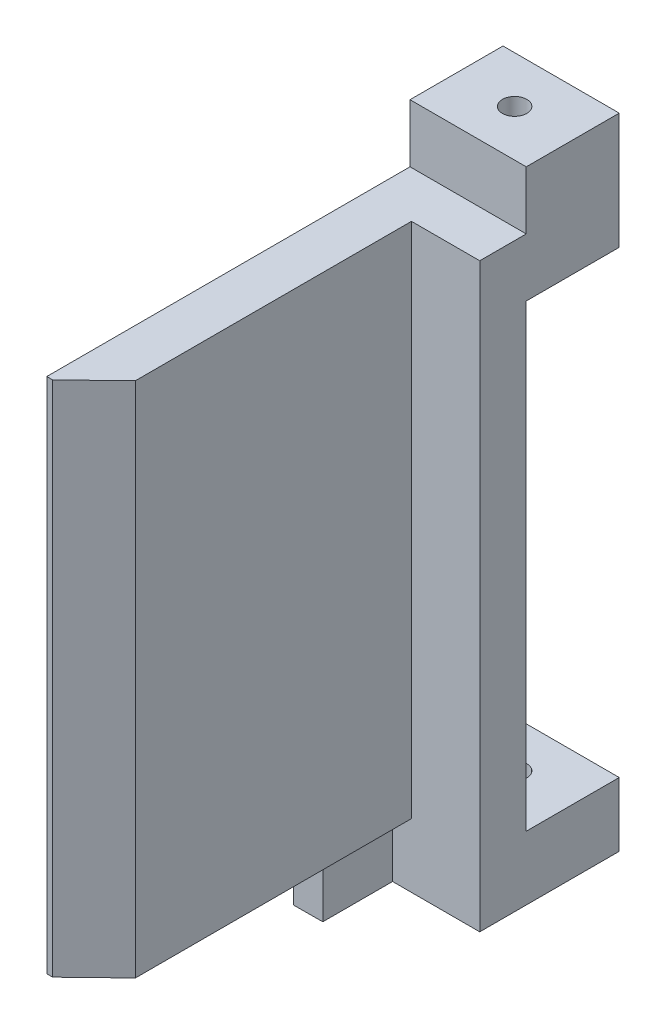
ISO-10303-21;
HEADER;
FILE_DESCRIPTION(('STEP AP214'),'2;1');
FILE_NAME('part.step','',(''),(''),'','','');
FILE_SCHEMA(('AUTOMOTIVE_DESIGN { 1 0 10303 214 1 1 1 1 }'));
ENDSEC;
DATA;
#1=APPLICATION_CONTEXT('core data for automotive mechanical design processes');
#2=APPLICATION_PROTOCOL_DEFINITION('international standard','automotive_design',2000,#1);
#3=PRODUCT_CONTEXT('',#1,'mechanical');
#4=PRODUCT('Part','Part','',(#3));
#5=PRODUCT_RELATED_PRODUCT_CATEGORY('part','',(#4));
#6=PRODUCT_DEFINITION_FORMATION('','',#4);
#7=PRODUCT_DEFINITION_CONTEXT('part definition',#1,'design');
#8=PRODUCT_DEFINITION('design','',#6,#7);
#9=PRODUCT_DEFINITION_SHAPE('','',#8);
#10=(LENGTH_UNIT() NAMED_UNIT(*) SI_UNIT(.MILLI.,.METRE.));
#11=(NAMED_UNIT(*) PLANE_ANGLE_UNIT() SI_UNIT($,.RADIAN.));
#12=(NAMED_UNIT(*) SI_UNIT($,.STERADIAN.) SOLID_ANGLE_UNIT());
#13=UNCERTAINTY_MEASURE_WITH_UNIT(LENGTH_MEASURE(1.E-05),#10,'distance_accuracy_value','');
#14=(GEOMETRIC_REPRESENTATION_CONTEXT(3) GLOBAL_UNCERTAINTY_ASSIGNED_CONTEXT((#13)) GLOBAL_UNIT_ASSIGNED_CONTEXT((#10,
#11,#12)) REPRESENTATION_CONTEXT('',''));
#15=CARTESIAN_POINT('',(0.,0.,0.));
#16=DIRECTION('',(0.,0.,1.));
#17=DIRECTION('',(1.,0.,0.));
#18=AXIS2_PLACEMENT_3D('',#15,#16,#17);
#19=CARTESIAN_POINT('',(-8.33755144192041E-13,150.195974268059,0.));
#20=DIRECTION('',(0.,1.,0.));
#21=DIRECTION('',(-1.,0.,0.));
#22=AXIS2_PLACEMENT_3D('',#19,#20,#21);
#23=PLANE('',#22);
#24=DIRECTION('',(0.,0.,-1.));
#25=VECTOR('',#24,1.);
#26=CARTESIAN_POINT('',(4.55898069389398,150.195974268059,32.2731298363772));
#27=LINE('',#26,#25);
#28=CARTESIAN_POINT('',(4.55898069389399,150.195974268059,48.2731298363772));
#29=VERTEX_POINT('',#28);
#30=CARTESIAN_POINT('',(4.55898069389399,150.195974268059,32.2731298363772));
#31=VERTEX_POINT('',#30);
#32=EDGE_CURVE('E268',#29,#31,#27,.T.);
#33=ORIENTED_EDGE('',*,*,#32,.F.);
#34=DIRECTION('',(-1.,0.,0.));
#35=VECTOR('',#34,1.);
#36=CARTESIAN_POINT('',(4.55898069389399,150.195974268059,48.2731298363772));
#37=LINE('',#36,#35);
#38=CARTESIAN_POINT('',(21.5589806938938,150.195974268059,48.2731298363772));
#39=VERTEX_POINT('',#38);
#40=EDGE_CURVE('E265',#39,#29,#37,.T.);
#41=ORIENTED_EDGE('',*,*,#40,.F.);
#42=DIRECTION('',(0.,0.,-1.));
#43=VECTOR('',#42,1.);
#44=CARTESIAN_POINT('',(21.5589806938938,150.195974268059,56.2731298363773));
#45=LINE('',#44,#43);
#46=CARTESIAN_POINT('',(21.5589806938938,150.195974268059,32.2731298363772));
#47=VERTEX_POINT('',#46);
#48=EDGE_CURVE('E186',#39,#47,#45,.T.);
#49=ORIENTED_EDGE('',*,*,#48,.T.);
#50=DIRECTION('',(-1.,0.,0.));
#51=VECTOR('',#50,1.);
#52=CARTESIAN_POINT('',(21.5589806938938,150.195974268059,32.2731298363772));
#53=LINE('',#52,#51);
#54=EDGE_CURVE('E188',#47,#31,#53,.T.);
#55=ORIENTED_EDGE('',*,*,#54,.T.);
#56=EDGE_LOOP('',(#33,#41,#49,#55));
#57=FACE_BOUND('',#56,.T.);
#58=CARTESIAN_POINT('',(11.5589806899984,150.195974268059,40.2731298363773));
#59=DIRECTION('',(0.,1.,0.));
#60=DIRECTION('',(-1.,0.,0.));
#61=AXIS2_PLACEMENT_3D('',#58,#59,#60);
#62=CIRCLE('',#61,2.1);
#63=CARTESIAN_POINT('',(9.4589806899984,150.195974268059,40.2731298363773));
#64=VERTEX_POINT('',#63);
#65=EDGE_CURVE('E180',#64,#64,#62,.T.);
#66=ORIENTED_EDGE('',*,*,#65,.F.);
#67=EDGE_LOOP('',(#66));
#68=FACE_BOUND('',#67,.T.);
#69=ADVANCED_FACE('F33',(#57,#68),#23,.T.);
#70=CARTESIAN_POINT('',(-7.72692877837658E-13,139.195974268059,0.));
#71=DIRECTION('',(0.,1.,0.));
#72=DIRECTION('',(-1.,0.,0.));
#73=AXIS2_PLACEMENT_3D('',#70,#71,#72);
#74=PLANE('',#73);
#75=DIRECTION('',(0.,0.,-1.));
#76=VECTOR('',#75,1.);
#77=CARTESIAN_POINT('',(21.5589806938939,139.195974268059,56.2731298363773));
#78=LINE('',#77,#76);
#79=CARTESIAN_POINT('',(21.5589806938939,139.195974268059,56.2731298363773));
#80=VERTEX_POINT('',#79);
#81=CARTESIAN_POINT('',(21.5589806938938,139.195974268059,32.2731298363772));
#82=VERTEX_POINT('',#81);
#83=EDGE_CURVE('E183',#80,#82,#78,.T.);
#84=ORIENTED_EDGE('',*,*,#83,.F.);
#85=DIRECTION('',(1.,0.,0.));
#86=VECTOR('',#85,1.);
#87=CARTESIAN_POINT('',(6.55898069389385,139.195974268059,56.2731298363773));
#88=LINE('',#87,#86);
#89=CARTESIAN_POINT('',(6.55898069389385,139.195974268059,56.2731298363773));
#90=VERTEX_POINT('',#89);
#91=EDGE_CURVE('E189',#90,#80,#88,.T.);
#92=ORIENTED_EDGE('',*,*,#91,.F.);
#93=DIRECTION('',(0.,0.,-1.));
#94=VECTOR('',#93,1.);
#95=CARTESIAN_POINT('',(6.55898069389385,139.195974268059,68.2731298363773));
#96=LINE('',#95,#94);
#97=CARTESIAN_POINT('',(6.55898069389385,139.195974268059,68.2731298363773));
#98=VERTEX_POINT('',#97);
#99=EDGE_CURVE('E208',#98,#90,#96,.T.);
#100=ORIENTED_EDGE('',*,*,#99,.F.);
#101=DIRECTION('',(0.999980786461218,0.,-0.00619892800447683));
#102=VECTOR('',#101,1.);
#103=CARTESIAN_POINT('',(1.55898069389405,139.195974268059,68.3041250719278));
#104=LINE('',#103,#102);
#105=CARTESIAN_POINT('',(1.55898069389405,139.195974268059,68.3041250719278));
#106=VERTEX_POINT('',#105);
#107=EDGE_CURVE('E206',#106,#98,#104,.T.);
#108=ORIENTED_EDGE('',*,*,#107,.F.);
#109=DIRECTION('',(0.,0.,1.));
#110=VECTOR('',#109,1.);
#111=CARTESIAN_POINT('',(1.55898069389405,139.195974268059,32.2731298363772));
#112=LINE('',#111,#110);
#113=CARTESIAN_POINT('',(1.55898069389405,139.195974268059,32.2731298363772));
#114=VERTEX_POINT('',#113);
#115=EDGE_CURVE('E204',#114,#106,#112,.T.);
#116=ORIENTED_EDGE('',*,*,#115,.F.);
#117=DIRECTION('',(-1.,0.,0.));
#118=VECTOR('',#117,1.);
#119=CARTESIAN_POINT('',(21.5589806938938,139.195974268059,32.2731298363772));
#120=LINE('',#119,#118);
#121=EDGE_CURVE('E202',#82,#114,#120,.T.);
#122=ORIENTED_EDGE('',*,*,#121,.F.);
#123=EDGE_LOOP('',(#84,#92,#100,#108,#116,#122));
#124=FACE_BOUND('',#123,.T.);
#125=CARTESIAN_POINT('',(11.5589806899985,139.195974268059,40.2731298363773));
#126=DIRECTION('',(0.,1.,0.));
#127=DIRECTION('',(-1.,0.,0.));
#128=AXIS2_PLACEMENT_3D('',#125,#126,#127);
#129=CIRCLE('',#128,2.1);
#130=CARTESIAN_POINT('',(9.45898068999846,139.195974268059,40.2731298363773));
#131=VERTEX_POINT('',#130);
#132=EDGE_CURVE('E175',#131,#131,#129,.T.);
#133=ORIENTED_EDGE('',*,*,#132,.T.);
#134=EDGE_LOOP('',(#133));
#135=FACE_BOUND('',#134,.T.);
#136=ADVANCED_FACE('F235',(#124,#135),#74,.F.);
#137=CARTESIAN_POINT('',(21.5589806938938,150.195974268059,56.2731298363773));
#138=DIRECTION('',(-1.,0.,0.));
#139=DIRECTION('',(0.,-1.,0.));
#140=AXIS2_PLACEMENT_3D('',#137,#138,#139);
#141=PLANE('',#140);
#142=DIRECTION('',(0.,0.,-1.));
#143=VECTOR('',#142,1.);
#144=CARTESIAN_POINT('',(21.5589806938932,249.195974268059,56.2731298363773));
#145=LINE('',#144,#143);
#146=CARTESIAN_POINT('',(21.5589806938931,249.195974268059,48.2731298363773));
#147=VERTEX_POINT('',#146);
#148=CARTESIAN_POINT('',(21.5589806938929,249.195974268059,32.2731298363772));
#149=VERTEX_POINT('',#148);
#150=EDGE_CURVE('E309',#147,#149,#145,.T.);
#151=ORIENTED_EDGE('',*,*,#150,.F.);
#152=DIRECTION('',(0.,1.,0.));
#153=VECTOR('',#152,1.);
#154=CARTESIAN_POINT('',(21.5589806938933,239.195974268059,48.2731298363773));
#155=LINE('',#154,#153);
#156=CARTESIAN_POINT('',(21.5589806938933,239.195974268059,48.2731298363773));
#157=VERTEX_POINT('',#156);
#158=EDGE_CURVE('E48',#157,#147,#155,.T.);
#159=ORIENTED_EDGE('',*,*,#158,.F.);
#160=DIRECTION('',(0.,0.,-1.));
#161=VECTOR('',#160,1.);
#162=CARTESIAN_POINT('',(21.5589806938933,239.195974268059,48.2731298363773));
#163=LINE('',#162,#161);
#164=CARTESIAN_POINT('',(21.5589806938933,239.195974268059,56.2731298363773));
#165=VERTEX_POINT('',#164);
#166=EDGE_CURVE('E324',#165,#157,#163,.T.);
#167=ORIENTED_EDGE('',*,*,#166,.F.);
#168=DIRECTION('',(0.,-1.,0.));
#169=VECTOR('',#168,1.);
#170=CARTESIAN_POINT('',(21.5589806938938,150.195974268059,56.2731298363773));
#171=LINE('',#170,#169);
#172=EDGE_CURVE('E199',#165,#80,#171,.T.);
#173=ORIENTED_EDGE('',*,*,#172,.T.);
#174=ORIENTED_EDGE('',*,*,#83,.T.);
#175=DIRECTION('',(0.,-1.,0.));
#176=VECTOR('',#175,1.);
#177=CARTESIAN_POINT('',(21.5589806938938,150.195974268059,32.2731298363772));
#178=LINE('',#177,#176);
#179=EDGE_CURVE('E11',#47,#82,#178,.T.);
#180=ORIENTED_EDGE('',*,*,#179,.F.);
#181=ORIENTED_EDGE('',*,*,#48,.F.);
#182=DIRECTION('',(0.,-1.,0.));
#183=VECTOR('',#182,1.);
#184=CARTESIAN_POINT('',(21.5589806938934,229.195974268059,48.2731298363773));
#185=LINE('',#184,#183);
#186=CARTESIAN_POINT('',(21.5589806938934,229.195974268059,48.2731298363773));
#187=VERTEX_POINT('',#186);
#188=EDGE_CURVE('E278',#187,#39,#185,.T.);
#189=ORIENTED_EDGE('',*,*,#188,.F.);
#190=DIRECTION('',(0.,0.,-1.));
#191=VECTOR('',#190,1.);
#192=CARTESIAN_POINT('',(21.5589806938934,229.195974268059,56.2731298363773));
#193=LINE('',#192,#191);
#194=CARTESIAN_POINT('',(21.5589806938931,229.195974268059,32.2731298363772));
#195=VERTEX_POINT('',#194);
#196=EDGE_CURVE('E255',#187,#195,#193,.T.);
#197=ORIENTED_EDGE('',*,*,#196,.T.);
#198=DIRECTION('',(0.,1.,0.));
#199=VECTOR('',#198,1.);
#200=CARTESIAN_POINT('',(21.5589806938931,229.195974268059,32.2731298363772));
#201=LINE('',#200,#199);
#202=EDGE_CURVE('E250',#195,#149,#201,.T.);
#203=ORIENTED_EDGE('',*,*,#202,.T.);
#204=EDGE_LOOP('',(#151,#159,#167,#173,#174,#180,#181,#189,#197,#203));
#205=FACE_BOUND('',#204,.T.);
#206=ADVANCED_FACE('F35',(#205),#141,.F.);
#207=CARTESIAN_POINT('',(21.5589806938938,150.195974268059,32.2731298363772));
#208=DIRECTION('',(0.,0.,1.));
#209=DIRECTION('',(1.,0.,0.));
#210=AXIS2_PLACEMENT_3D('',#207,#208,#209);
#211=PLANE('',#210);
#212=ORIENTED_EDGE('',*,*,#121,.T.);
#213=DIRECTION('',(0.,-1.,0.));
#214=VECTOR('',#213,1.);
#215=CARTESIAN_POINT('',(1.55898069389398,150.195974268059,32.2731298363772));
#216=LINE('',#215,#214);
#217=CARTESIAN_POINT('',(1.5589806938934,249.195974268059,32.2731298363772));
#218=VERTEX_POINT('',#217);
#219=EDGE_CURVE('E41',#218,#114,#216,.T.);
#220=ORIENTED_EDGE('',*,*,#219,.F.);
#221=DIRECTION('',(-1.,0.,0.));
#222=VECTOR('',#221,1.);
#223=CARTESIAN_POINT('',(21.5589806938929,249.195974268059,32.2731298363772));
#224=LINE('',#223,#222);
#225=EDGE_CURVE('E312',#149,#218,#224,.T.);
#226=ORIENTED_EDGE('',*,*,#225,.F.);
#227=ORIENTED_EDGE('',*,*,#202,.F.);
#228=DIRECTION('',(-1.,0.,0.));
#229=VECTOR('',#228,1.);
#230=CARTESIAN_POINT('',(21.5589806938931,229.195974268059,32.2731298363772));
#231=LINE('',#230,#229);
#232=CARTESIAN_POINT('',(4.55898069389355,229.195974268059,32.2731298363772));
#233=VERTEX_POINT('',#232);
#234=EDGE_CURVE('E296',#195,#233,#231,.T.);
#235=ORIENTED_EDGE('',*,*,#234,.T.);
#236=DIRECTION('',(0.,-1.,0.));
#237=VECTOR('',#236,1.);
#238=CARTESIAN_POINT('',(4.55898069389355,229.195974268059,32.2731298363772));
#239=LINE('',#238,#237);
#240=EDGE_CURVE('E272',#233,#31,#239,.T.);
#241=ORIENTED_EDGE('',*,*,#240,.T.);
#242=ORIENTED_EDGE('',*,*,#54,.F.);
#243=ORIENTED_EDGE('',*,*,#179,.T.);
#244=EDGE_LOOP('',(#212,#220,#226,#227,#235,#241,#242,#243));
#245=FACE_BOUND('',#244,.T.);
#246=ADVANCED_FACE('F293',(#245),#211,.F.);
#247=CARTESIAN_POINT('',(1.55898069389398,150.195974268059,32.2731298363772));
#248=DIRECTION('',(1.,0.,0.));
#249=DIRECTION('',(0.,1.,0.));
#250=AXIS2_PLACEMENT_3D('',#247,#248,#249);
#251=PLANE('',#250);
#252=DIRECTION('',(0.,0.,1.));
#253=VECTOR('',#252,1.);
#254=CARTESIAN_POINT('',(1.55898069389348,239.195974268059,110.773129836377));
#255=LINE('',#254,#253);
#256=CARTESIAN_POINT('',(1.55898069389347,239.195974268059,48.2731298363773));
#257=VERTEX_POINT('',#256);
#258=CARTESIAN_POINT('',(1.55898069389348,239.195974268059,110.773129836377));
#259=VERTEX_POINT('',#258);
#260=EDGE_CURVE('E154',#257,#259,#255,.T.);
#261=ORIENTED_EDGE('',*,*,#260,.F.);
#262=DIRECTION('',(0.,1.,0.));
#263=VECTOR('',#262,1.);
#264=CARTESIAN_POINT('',(1.55898069389347,239.195974268059,48.2731298363773));
#265=LINE('',#264,#263);
#266=CARTESIAN_POINT('',(1.55898069389339,249.195974268059,48.2731298363773));
#267=VERTEX_POINT('',#266);
#268=EDGE_CURVE('E317',#257,#267,#265,.T.);
#269=ORIENTED_EDGE('',*,*,#268,.T.);
#270=DIRECTION('',(0.,0.,1.));
#271=VECTOR('',#270,1.);
#272=CARTESIAN_POINT('',(1.5589806938934,249.195974268059,32.2731298363772));
#273=LINE('',#272,#271);
#274=EDGE_CURVE('E228',#218,#267,#273,.T.);
#275=ORIENTED_EDGE('',*,*,#274,.F.);
#276=ORIENTED_EDGE('',*,*,#219,.T.);
#277=ORIENTED_EDGE('',*,*,#115,.T.);
#278=DIRECTION('',(0.,-1.,0.));
#279=VECTOR('',#278,1.);
#280=CARTESIAN_POINT('',(1.55898069389398,150.195974268059,68.3041250719278));
#281=LINE('',#280,#279);
#282=CARTESIAN_POINT('',(1.55898069389398,150.195974268059,68.3041250719278));
#283=VERTEX_POINT('',#282);
#284=EDGE_CURVE('E219',#283,#106,#281,.T.);
#285=ORIENTED_EDGE('',*,*,#284,.F.);
#286=DIRECTION('',(0.,0.,1.));
#287=VECTOR('',#286,1.);
#288=CARTESIAN_POINT('',(1.55898069389398,150.195974268059,110.773129836377));
#289=LINE('',#288,#287);
#290=CARTESIAN_POINT('',(1.55898069389398,150.195974268059,110.773129836377));
#291=VERTEX_POINT('',#290);
#292=EDGE_CURVE('E249',#283,#291,#289,.T.);
#293=ORIENTED_EDGE('',*,*,#292,.T.);
#294=DIRECTION('',(0.,-1.,0.));
#295=VECTOR('',#294,1.);
#296=CARTESIAN_POINT('',(1.55898069389355,229.195974268059,110.773129836377));
#297=LINE('',#296,#295);
#298=EDGE_CURVE('E173',#259,#291,#297,.T.);
#299=ORIENTED_EDGE('',*,*,#298,.F.);
#300=EDGE_LOOP('',(#261,#269,#275,#276,#277,#285,#293,#299));
#301=FACE_BOUND('',#300,.T.);
#302=ADVANCED_FACE('F225',(#301),#251,.F.);
#303=CARTESIAN_POINT('',(1.55898069389398,150.195974268059,68.3041250719278));
#304=DIRECTION('',(-0.00619892800447683,0.,-0.999980786461218));
#305=DIRECTION('',(-0.999980786461218,0.,0.00619892800447683));
#306=AXIS2_PLACEMENT_3D('',#303,#304,#305);
#307=PLANE('',#306);
#308=ORIENTED_EDGE('',*,*,#107,.T.);
#309=DIRECTION('',(0.,-1.,0.));
#310=VECTOR('',#309,1.);
#311=CARTESIAN_POINT('',(6.55898069389379,150.195974268059,68.2731298363773));
#312=LINE('',#311,#310);
#313=CARTESIAN_POINT('',(6.55898069389379,150.195974268059,68.2731298363773));
#314=VERTEX_POINT('',#313);
#315=EDGE_CURVE('E216',#314,#98,#312,.T.);
#316=ORIENTED_EDGE('',*,*,#315,.F.);
#317=DIRECTION('',(0.999980786461218,0.,-0.00619892800447683));
#318=VECTOR('',#317,1.);
#319=CARTESIAN_POINT('',(1.55898069389398,150.195974268059,68.3041250719278));
#320=LINE('',#319,#318);
#321=EDGE_CURVE('E191',#283,#314,#320,.T.);
#322=ORIENTED_EDGE('',*,*,#321,.F.);
#323=ORIENTED_EDGE('',*,*,#284,.T.);
#324=EDGE_LOOP('',(#308,#316,#322,#323));
#325=FACE_BOUND('',#324,.T.);
#326=ADVANCED_FACE('F240',(#325),#307,.F.);
#327=CARTESIAN_POINT('',(6.55898069389379,150.195974268059,68.2731298363773));
#328=DIRECTION('',(-1.,0.,0.));
#329=DIRECTION('',(0.,-1.,0.));
#330=AXIS2_PLACEMENT_3D('',#327,#328,#329);
#331=PLANE('',#330);
#332=ORIENTED_EDGE('',*,*,#99,.T.);
#333=DIRECTION('',(0.,-1.,0.));
#334=VECTOR('',#333,1.);
#335=CARTESIAN_POINT('',(6.55898069389379,150.195974268059,56.2731298363773));
#336=LINE('',#335,#334);
#337=CARTESIAN_POINT('',(6.55898069389379,150.195974268059,56.2731298363773));
#338=VERTEX_POINT('',#337);
#339=EDGE_CURVE('E213',#338,#90,#336,.T.);
#340=ORIENTED_EDGE('',*,*,#339,.F.);
#341=DIRECTION('',(0.,0.,-1.));
#342=VECTOR('',#341,1.);
#343=CARTESIAN_POINT('',(6.55898069389379,150.195974268059,68.2731298363773));
#344=LINE('',#343,#342);
#345=EDGE_CURVE('E194',#314,#338,#344,.T.);
#346=ORIENTED_EDGE('',*,*,#345,.F.);
#347=ORIENTED_EDGE('',*,*,#315,.T.);
#348=EDGE_LOOP('',(#332,#340,#346,#347));
#349=FACE_BOUND('',#348,.T.);
#350=ADVANCED_FACE('F244',(#349),#331,.F.);
#351=CARTESIAN_POINT('',(6.55898069389379,150.195974268059,56.2731298363773));
#352=DIRECTION('',(0.,0.,-1.));
#353=DIRECTION('',(-1.,0.,0.));
#354=AXIS2_PLACEMENT_3D('',#351,#352,#353);
#355=PLANE('',#354);
#356=ORIENTED_EDGE('',*,*,#172,.F.);
#357=DIRECTION('',(1.,0.,0.));
#358=VECTOR('',#357,1.);
#359=CARTESIAN_POINT('',(21.5589806938933,239.195974268059,56.2731298363773));
#360=LINE('',#359,#358);
#361=CARTESIAN_POINT('',(9.80898069389373,239.195974268059,56.2731298363773));
#362=VERTEX_POINT('',#361);
#363=EDGE_CURVE('E327',#362,#165,#360,.T.);
#364=ORIENTED_EDGE('',*,*,#363,.F.);
#365=DIRECTION('',(0.,-1.,0.));
#366=VECTOR('',#365,1.);
#367=CARTESIAN_POINT('',(9.8089806938938,229.195974268059,56.2731298363773));
#368=LINE('',#367,#366);
#369=CARTESIAN_POINT('',(9.80898069389423,150.195974268059,56.2731298363773));
#370=VERTEX_POINT('',#369);
#371=EDGE_CURVE('E56',#362,#370,#368,.T.);
#372=ORIENTED_EDGE('',*,*,#371,.T.);
#373=DIRECTION('',(1.,0.,0.));
#374=VECTOR('',#373,1.);
#375=CARTESIAN_POINT('',(6.55898069389379,150.195974268059,56.2731298363773));
#376=LINE('',#375,#374);
#377=EDGE_CURVE('E197',#338,#370,#376,.T.);
#378=ORIENTED_EDGE('',*,*,#377,.F.);
#379=ORIENTED_EDGE('',*,*,#339,.T.);
#380=ORIENTED_EDGE('',*,*,#91,.T.);
#381=EDGE_LOOP('',(#356,#364,#372,#378,#379,#380));
#382=FACE_BOUND('',#381,.T.);
#383=ADVANCED_FACE('F332',(#382),#355,.F.);
#384=CARTESIAN_POINT('',(11.5589806899984,150.195974268059,40.2731298363773));
#385=DIRECTION('',(0.,-1.,0.));
#386=DIRECTION('',(1.,0.,0.));
#387=AXIS2_PLACEMENT_3D('',#384,#385,#386);
#388=CYLINDRICAL_SURFACE('',#387,2.1);
#389=ORIENTED_EDGE('',*,*,#65,.T.);
#390=EDGE_LOOP('',(#389));
#391=FACE_BOUND('',#390,.T.);
#392=ORIENTED_EDGE('',*,*,#132,.F.);
#393=EDGE_LOOP('',(#392));
#394=FACE_BOUND('',#393,.T.);
#395=ADVANCED_FACE('F355',(#391,#394),#388,.F.);
#396=CARTESIAN_POINT('',(2.55898069389336,229.195974268059,110.773129836377));
#397=DIRECTION('',(0.,0.,-1.));
#398=DIRECTION('',(0.,1.,0.));
#399=AXIS2_PLACEMENT_3D('',#396,#397,#398);
#400=PLANE('',#399);
#401=DIRECTION('',(0.,-1.,0.));
#402=VECTOR('',#401,1.);
#403=CARTESIAN_POINT('',(2.55898069389336,229.195974268059,110.773129836377));
#404=LINE('',#403,#402);
#405=CARTESIAN_POINT('',(2.5589806938933,239.195974268059,110.773129836377));
#406=VERTEX_POINT('',#405);
#407=CARTESIAN_POINT('',(2.5589806938938,150.195974268059,110.773129836377));
#408=VERTEX_POINT('',#407);
#409=EDGE_CURVE('E164',#406,#408,#404,.T.);
#410=ORIENTED_EDGE('',*,*,#409,.F.);
#411=DIRECTION('',(1.,0.,0.));
#412=VECTOR('',#411,1.);
#413=CARTESIAN_POINT('',(2.5589806938933,239.195974268059,110.773129836377));
#414=LINE('',#413,#412);
#415=EDGE_CURVE('E147',#259,#406,#414,.T.);
#416=ORIENTED_EDGE('',*,*,#415,.F.);
#417=ORIENTED_EDGE('',*,*,#298,.T.);
#418=DIRECTION('',(1.,0.,0.));
#419=VECTOR('',#418,1.);
#420=CARTESIAN_POINT('',(2.5589806938938,150.195974268059,110.773129836377));
#421=LINE('',#420,#419);
#422=EDGE_CURVE('E171',#291,#408,#421,.T.);
#423=ORIENTED_EDGE('',*,*,#422,.T.);
#424=EDGE_LOOP('',(#410,#416,#417,#423));
#425=FACE_BOUND('',#424,.T.);
#426=ADVANCED_FACE('F169',(#425),#400,.F.);
#427=CARTESIAN_POINT('',(9.8089806938938,229.195974268059,103.773129836377));
#428=DIRECTION('',(-0.694594513699546,0.,-0.71940146061743));
#429=DIRECTION('',(-0.71940146061743,0.,0.694594513699546));
#430=AXIS2_PLACEMENT_3D('',#427,#428,#429);
#431=PLANE('',#430);
#432=DIRECTION('',(0.,-1.,0.));
#433=VECTOR('',#432,1.);
#434=CARTESIAN_POINT('',(9.8089806938938,229.195974268059,103.773129836377));
#435=LINE('',#434,#433);
#436=CARTESIAN_POINT('',(9.80898069389373,239.195974268059,103.773129836377));
#437=VERTEX_POINT('',#436);
#438=CARTESIAN_POINT('',(9.80898069389423,150.195974268059,103.773129836377));
#439=VERTEX_POINT('',#438);
#440=EDGE_CURVE('E166',#437,#439,#435,.T.);
#441=ORIENTED_EDGE('',*,*,#440,.F.);
#442=DIRECTION('',(0.71940146061743,0.,-0.694594513699546));
#443=VECTOR('',#442,1.);
#444=CARTESIAN_POINT('',(9.80898069389373,239.195974268059,103.773129836377));
#445=LINE('',#444,#443);
#446=EDGE_CURVE('E150',#406,#437,#445,.T.);
#447=ORIENTED_EDGE('',*,*,#446,.F.);
#448=ORIENTED_EDGE('',*,*,#409,.T.);
#449=DIRECTION('',(0.71940146061743,0.,-0.694594513699546));
#450=VECTOR('',#449,1.);
#451=CARTESIAN_POINT('',(9.80898069389423,150.195974268059,103.773129836377));
#452=LINE('',#451,#450);
#453=EDGE_CURVE('E252',#408,#439,#452,.T.);
#454=ORIENTED_EDGE('',*,*,#453,.T.);
#455=EDGE_LOOP('',(#441,#447,#448,#454));
#456=FACE_BOUND('',#455,.T.);
#457=ADVANCED_FACE('F162',(#456),#431,.F.);
#458=CARTESIAN_POINT('',(9.8089806938938,229.195974268059,56.2731298363773));
#459=DIRECTION('',(-1.,0.,0.));
#460=DIRECTION('',(0.,-1.,0.));
#461=AXIS2_PLACEMENT_3D('',#458,#459,#460);
#462=PLANE('',#461);
#463=ORIENTED_EDGE('',*,*,#371,.F.);
#464=DIRECTION('',(0.,0.,-1.));
#465=VECTOR('',#464,1.);
#466=CARTESIAN_POINT('',(9.80898069389373,239.195974268059,56.2731298363773));
#467=LINE('',#466,#465);
#468=EDGE_CURVE('E167',#437,#362,#467,.T.);
#469=ORIENTED_EDGE('',*,*,#468,.F.);
#470=ORIENTED_EDGE('',*,*,#440,.T.);
#471=DIRECTION('',(0.,0.,-1.));
#472=VECTOR('',#471,1.);
#473=CARTESIAN_POINT('',(9.80898069389423,150.195974268059,56.2731298363773));
#474=LINE('',#473,#472);
#475=EDGE_CURVE('E262',#439,#370,#474,.T.);
#476=ORIENTED_EDGE('',*,*,#475,.T.);
#477=EDGE_LOOP('',(#463,#469,#470,#476));
#478=FACE_BOUND('',#477,.T.);
#479=ADVANCED_FACE('F333',(#478),#462,.F.);
#480=CARTESIAN_POINT('',(4.55898069389355,229.195974268059,48.2731298363772));
#481=DIRECTION('',(0.,0.,1.));
#482=DIRECTION('',(1.,0.,0.));
#483=AXIS2_PLACEMENT_3D('',#480,#481,#482);
#484=PLANE('',#483);
#485=ORIENTED_EDGE('',*,*,#40,.T.);
#486=DIRECTION('',(0.,-1.,0.));
#487=VECTOR('',#486,1.);
#488=CARTESIAN_POINT('',(4.55898069389355,229.195974268059,48.2731298363772));
#489=LINE('',#488,#487);
#490=CARTESIAN_POINT('',(4.55898069389355,229.195974268059,48.2731298363772));
#491=VERTEX_POINT('',#490);
#492=EDGE_CURVE('E275',#491,#29,#489,.T.);
#493=ORIENTED_EDGE('',*,*,#492,.F.);
#494=DIRECTION('',(-1.,0.,0.));
#495=VECTOR('',#494,1.);
#496=CARTESIAN_POINT('',(4.55898069389355,229.195974268059,48.2731298363772));
#497=LINE('',#496,#495);
#498=EDGE_CURVE('E271',#187,#491,#497,.T.);
#499=ORIENTED_EDGE('',*,*,#498,.F.);
#500=ORIENTED_EDGE('',*,*,#188,.T.);
#501=EDGE_LOOP('',(#485,#493,#499,#500));
#502=FACE_BOUND('',#501,.T.);
#503=ADVANCED_FACE('F282',(#502),#484,.F.);
#504=CARTESIAN_POINT('',(4.55898069389355,229.195974268059,32.2731298363772));
#505=DIRECTION('',(-1.,0.,0.));
#506=DIRECTION('',(0.,-1.,0.));
#507=AXIS2_PLACEMENT_3D('',#504,#505,#506);
#508=PLANE('',#507);
#509=ORIENTED_EDGE('',*,*,#32,.T.);
#510=ORIENTED_EDGE('',*,*,#240,.F.);
#511=DIRECTION('',(0.,0.,-1.));
#512=VECTOR('',#511,1.);
#513=CARTESIAN_POINT('',(4.55898069389355,229.195974268059,32.2731298363772));
#514=LINE('',#513,#512);
#515=EDGE_CURVE('E258',#491,#233,#514,.T.);
#516=ORIENTED_EDGE('',*,*,#515,.F.);
#517=ORIENTED_EDGE('',*,*,#492,.T.);
#518=EDGE_LOOP('',(#509,#510,#516,#517));
#519=FACE_BOUND('',#518,.T.);
#520=ADVANCED_FACE('F300',(#519),#508,.F.);
#521=CARTESIAN_POINT('',(-1.38959190698672E-12,150.195974268059,0.));
#522=DIRECTION('',(0.,-1.,0.));
#523=DIRECTION('',(1.,0.,0.));
#524=AXIS2_PLACEMENT_3D('',#521,#522,#523);
#525=PLANE('',#524);
#526=ORIENTED_EDGE('',*,*,#292,.F.);
#527=ORIENTED_EDGE('',*,*,#321,.T.);
#528=ORIENTED_EDGE('',*,*,#345,.T.);
#529=ORIENTED_EDGE('',*,*,#377,.T.);
#530=ORIENTED_EDGE('',*,*,#475,.F.);
#531=ORIENTED_EDGE('',*,*,#453,.F.);
#532=ORIENTED_EDGE('',*,*,#422,.F.);
#533=EDGE_LOOP('',(#526,#527,#528,#529,#530,#531,#532));
#534=FACE_BOUND('',#533,.T.);
#535=ADVANCED_FACE('F247',(#534),#525,.T.);
#536=CARTESIAN_POINT('',(-1.89918799983996E-12,229.195974268059,0.));
#537=DIRECTION('',(0.,1.,0.));
#538=DIRECTION('',(-1.,0.,0.));
#539=AXIS2_PLACEMENT_3D('',#536,#537,#538);
#540=PLANE('',#539);
#541=CARTESIAN_POINT('',(11.5589806899977,229.195974268059,40.2731298363773));
#542=DIRECTION('',(0.,1.,0.));
#543=DIRECTION('',(-1.,0.,0.));
#544=AXIS2_PLACEMENT_3D('',#541,#542,#543);
#545=CIRCLE('',#544,2.1);
#546=CARTESIAN_POINT('',(9.45898068999766,229.195974268059,40.2731298363773));
#547=VERTEX_POINT('',#546);
#548=EDGE_CURVE('E306',#547,#547,#545,.T.);
#549=ORIENTED_EDGE('',*,*,#548,.T.);
#550=EDGE_LOOP('',(#549));
#551=FACE_BOUND('',#550,.T.);
#552=ORIENTED_EDGE('',*,*,#196,.F.);
#553=ORIENTED_EDGE('',*,*,#498,.T.);
#554=ORIENTED_EDGE('',*,*,#515,.T.);
#555=ORIENTED_EDGE('',*,*,#234,.F.);
#556=EDGE_LOOP('',(#552,#553,#554,#555));
#557=FACE_BOUND('',#556,.T.);
#558=ADVANCED_FACE('F302',(#551,#557),#540,.F.);
#559=CARTESIAN_POINT('',(11.5589806899977,229.195974268059,40.2731298363773));
#560=DIRECTION('',(0.,1.,0.));
#561=DIRECTION('',(-1.,0.,0.));
#562=AXIS2_PLACEMENT_3D('',#559,#560,#561);
#563=CYLINDRICAL_SURFACE('',#562,2.1);
#564=ORIENTED_EDGE('',*,*,#548,.F.);
#565=EDGE_LOOP('',(#564));
#566=FACE_BOUND('',#565,.T.);
#567=CARTESIAN_POINT('',(11.5589806899975,249.195974268059,40.2731298363773));
#568=DIRECTION('',(0.,1.,0.));
#569=DIRECTION('',(-1.,0.,0.));
#570=AXIS2_PLACEMENT_3D('',#567,#568,#569);
#571=CIRCLE('',#570,2.1);
#572=CARTESIAN_POINT('',(9.45898068999748,249.195974268059,40.2731298363773));
#573=VERTEX_POINT('',#572);
#574=EDGE_CURVE('E314',#573,#573,#571,.T.);
#575=ORIENTED_EDGE('',*,*,#574,.T.);
#576=EDGE_LOOP('',(#575));
#577=FACE_BOUND('',#576,.T.);
#578=ADVANCED_FACE('F346',(#566,#577),#563,.F.);
#579=CARTESIAN_POINT('',(-2.08422517061082E-12,249.195974268059,0.));
#580=DIRECTION('',(0.,1.,0.));
#581=DIRECTION('',(-1.,0.,0.));
#582=AXIS2_PLACEMENT_3D('',#579,#580,#581);
#583=PLANE('',#582);
#584=DIRECTION('',(-1.,0.,0.));
#585=VECTOR('',#584,1.);
#586=CARTESIAN_POINT('',(1.55898069389339,249.195974268059,48.2731298363773));
#587=LINE('',#586,#585);
#588=EDGE_CURVE('E158',#147,#267,#587,.T.);
#589=ORIENTED_EDGE('',*,*,#588,.F.);
#590=ORIENTED_EDGE('',*,*,#150,.T.);
#591=ORIENTED_EDGE('',*,*,#225,.T.);
#592=ORIENTED_EDGE('',*,*,#274,.T.);
#593=EDGE_LOOP('',(#589,#590,#591,#592));
#594=FACE_BOUND('',#593,.T.);
#595=ORIENTED_EDGE('',*,*,#574,.F.);
#596=EDGE_LOOP('',(#595));
#597=FACE_BOUND('',#596,.T.);
#598=ADVANCED_FACE('F336',(#594,#597),#583,.T.);
#599=CARTESIAN_POINT('',(1.55898069389347,239.195974268059,48.2731298363773));
#600=DIRECTION('',(0.,0.,-1.));
#601=DIRECTION('',(-1.,0.,0.));
#602=AXIS2_PLACEMENT_3D('',#599,#600,#601);
#603=PLANE('',#602);
#604=ORIENTED_EDGE('',*,*,#588,.T.);
#605=ORIENTED_EDGE('',*,*,#268,.F.);
#606=DIRECTION('',(-1.,0.,0.));
#607=VECTOR('',#606,1.);
#608=CARTESIAN_POINT('',(1.55898069389347,239.195974268059,48.2731298363773));
#609=LINE('',#608,#607);
#610=EDGE_CURVE('E322',#157,#257,#609,.T.);
#611=ORIENTED_EDGE('',*,*,#610,.F.);
#612=ORIENTED_EDGE('',*,*,#158,.T.);
#613=EDGE_LOOP('',(#604,#605,#611,#612));
#614=FACE_BOUND('',#613,.T.);
#615=ADVANCED_FACE('F338',(#614),#603,.F.);
#616=CARTESIAN_POINT('',(-6.83331098006179E-12,239.195974268059,0.));
#617=DIRECTION('',(0.,-1.,0.));
#618=DIRECTION('',(1.,0.,0.));
#619=AXIS2_PLACEMENT_3D('',#616,#617,#618);
#620=PLANE('',#619);
#621=ORIENTED_EDGE('',*,*,#415,.T.);
#622=ORIENTED_EDGE('',*,*,#446,.T.);
#623=ORIENTED_EDGE('',*,*,#468,.T.);
#624=ORIENTED_EDGE('',*,*,#363,.T.);
#625=ORIENTED_EDGE('',*,*,#166,.T.);
#626=ORIENTED_EDGE('',*,*,#610,.T.);
#627=ORIENTED_EDGE('',*,*,#260,.T.);
#628=EDGE_LOOP('',(#621,#622,#623,#624,#625,#626,#627));
#629=FACE_BOUND('',#628,.T.);
#630=ADVANCED_FACE('F149',(#629),#620,.F.);
#631=CLOSED_SHELL('',(#69,#136,#206,#246,#302,#326,#350,#383,#395,#426,#457,#479,#503,#520,#535,
#558,#578,#598,#615,#630));
#632=MANIFOLD_SOLID_BREP('B2',#631);
#633=ADVANCED_BREP_SHAPE_REPRESENTATION('',(#18,#632),#14);
#634=SHAPE_DEFINITION_REPRESENTATION(#9,#633);
ENDSEC;
END-ISO-10303-21;
